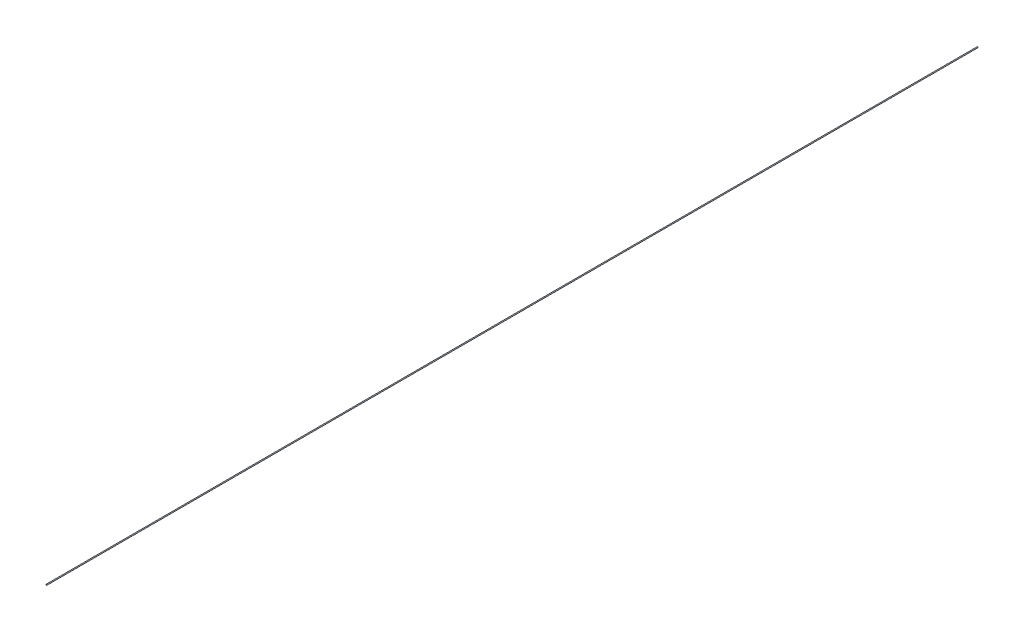
ISO-10303-21;
HEADER;
FILE_DESCRIPTION(('STEP AP214'),'2;1');
FILE_NAME('part.step','',(''),(''),'','','');
FILE_SCHEMA(('AUTOMOTIVE_DESIGN { 1 0 10303 214 1 1 1 1 }'));
ENDSEC;
DATA;
#1=APPLICATION_CONTEXT('core data for automotive mechanical design processes');
#2=APPLICATION_PROTOCOL_DEFINITION('international standard','automotive_design',2000,#1);
#3=PRODUCT_CONTEXT('',#1,'mechanical');
#4=PRODUCT('Part','Part','',(#3));
#5=PRODUCT_RELATED_PRODUCT_CATEGORY('part','',(#4));
#6=PRODUCT_DEFINITION_FORMATION('','',#4);
#7=PRODUCT_DEFINITION_CONTEXT('part definition',#1,'design');
#8=PRODUCT_DEFINITION('design','',#6,#7);
#9=PRODUCT_DEFINITION_SHAPE('','',#8);
#10=(LENGTH_UNIT() NAMED_UNIT(*) SI_UNIT(.MILLI.,.METRE.));
#11=(NAMED_UNIT(*) PLANE_ANGLE_UNIT() SI_UNIT($,.RADIAN.));
#12=(NAMED_UNIT(*) SI_UNIT($,.STERADIAN.) SOLID_ANGLE_UNIT());
#13=UNCERTAINTY_MEASURE_WITH_UNIT(LENGTH_MEASURE(1.E-05),#10,'distance_accuracy_value','');
#14=(GEOMETRIC_REPRESENTATION_CONTEXT(3) GLOBAL_UNCERTAINTY_ASSIGNED_CONTEXT((#13)) GLOBAL_UNIT_ASSIGNED_CONTEXT((#10,
#11,#12)) REPRESENTATION_CONTEXT('',''));
#15=CARTESIAN_POINT('',(0.,0.,0.));
#16=DIRECTION('',(0.,0.,1.));
#17=DIRECTION('',(1.,0.,0.));
#18=AXIS2_PLACEMENT_3D('',#15,#16,#17);
#19=CARTESIAN_POINT('',(0.,0.,508.));
#20=DIRECTION('',(0.,0.,-1.));
#21=DIRECTION('',(-1.,0.,0.));
#22=AXIS2_PLACEMENT_3D('',#19,#20,#21);
#23=CYLINDRICAL_SURFACE('',#22,0.5);
#24=CARTESIAN_POINT('',(0.,0.,507.6));
#25=DIRECTION('',(0.,0.,1.));
#26=DIRECTION('',(1.,0.,0.));
#27=AXIS2_PLACEMENT_3D('',#24,#25,#26);
#28=CIRCLE('',#27,0.5);
#29=CARTESIAN_POINT('',(0.5,0.,507.6));
#30=VERTEX_POINT('',#29);
#31=EDGE_CURVE('E45',#30,#30,#28,.F.);
#32=ORIENTED_EDGE('',*,*,#31,.T.);
#33=EDGE_LOOP('',(#32));
#34=FACE_BOUND('',#33,.T.);
#35=CARTESIAN_POINT('',(0.,0.,-507.6));
#36=DIRECTION('',(0.,0.,1.));
#37=DIRECTION('',(1.,0.,0.));
#38=AXIS2_PLACEMENT_3D('',#35,#36,#37);
#39=CIRCLE('',#38,0.5);
#40=CARTESIAN_POINT('',(0.5,0.,-507.6));
#41=VERTEX_POINT('',#40);
#42=EDGE_CURVE('E50',#41,#41,#39,.T.);
#43=ORIENTED_EDGE('',*,*,#42,.T.);
#44=EDGE_LOOP('',(#43));
#45=FACE_BOUND('',#44,.T.);
#46=ADVANCED_FACE('F37',(#34,#45),#23,.T.);
#47=CARTESIAN_POINT('',(0.,0.,508.));
#48=DIRECTION('',(0.,0.,1.));
#49=DIRECTION('',(1.,0.,0.));
#50=AXIS2_PLACEMENT_3D('',#47,#48,#49);
#51=PLANE('',#50);
#52=CARTESIAN_POINT('',(0.,0.,508.));
#53=DIRECTION('',(0.,0.,1.));
#54=DIRECTION('',(1.,0.,0.));
#55=AXIS2_PLACEMENT_3D('',#52,#53,#54);
#56=CIRCLE('',#55,0.1);
#57=CARTESIAN_POINT('',(0.1,0.,508.));
#58=VERTEX_POINT('',#57);
#59=EDGE_CURVE('E55',#58,#58,#56,.T.);
#60=ORIENTED_EDGE('',*,*,#59,.T.);
#61=EDGE_LOOP('',(#60));
#62=FACE_BOUND('',#61,.T.);
#63=ADVANCED_FACE('F62',(#62),#51,.T.);
#64=CARTESIAN_POINT('',(0.,0.,-508.));
#65=DIRECTION('',(0.,0.,1.));
#66=DIRECTION('',(1.,0.,0.));
#67=AXIS2_PLACEMENT_3D('',#64,#65,#66);
#68=PLANE('',#67);
#69=CARTESIAN_POINT('',(0.,0.,-508.));
#70=DIRECTION('',(0.,0.,1.));
#71=DIRECTION('',(1.,0.,0.));
#72=AXIS2_PLACEMENT_3D('',#69,#70,#71);
#73=CIRCLE('',#72,0.1);
#74=CARTESIAN_POINT('',(0.1,0.,-508.));
#75=VERTEX_POINT('',#74);
#76=EDGE_CURVE('E10',#75,#75,#73,.F.);
#77=ORIENTED_EDGE('',*,*,#76,.T.);
#78=EDGE_LOOP('',(#77));
#79=FACE_BOUND('',#78,.T.);
#80=ADVANCED_FACE('F66',(#79),#68,.F.);
#81=CARTESIAN_POINT('',(0.,0.,507.6));
#82=DIRECTION('',(0.,0.,1.));
#83=DIRECTION('',(1.,0.,0.));
#84=AXIS2_PLACEMENT_3D('',#81,#82,#83);
#85=DEGENERATE_TOROIDAL_SURFACE('',#84,0.1,0.4,.T.);
#86=ORIENTED_EDGE('',*,*,#31,.F.);
#87=EDGE_LOOP('',(#86));
#88=FACE_BOUND('',#87,.T.);
#89=ORIENTED_EDGE('',*,*,#59,.F.);
#90=EDGE_LOOP('',(#89));
#91=FACE_BOUND('',#90,.T.);
#92=ADVANCED_FACE('F64',(#88,#91),#85,.T.);
#93=CARTESIAN_POINT('',(0.,0.,-507.6));
#94=DIRECTION('',(0.,0.,1.));
#95=DIRECTION('',(1.,0.,0.));
#96=AXIS2_PLACEMENT_3D('',#93,#94,#95);
#97=DEGENERATE_TOROIDAL_SURFACE('',#96,0.1,0.4,.T.);
#98=ORIENTED_EDGE('',*,*,#76,.F.);
#99=EDGE_LOOP('',(#98));
#100=FACE_BOUND('',#99,.T.);
#101=ORIENTED_EDGE('',*,*,#42,.F.);
#102=EDGE_LOOP('',(#101));
#103=FACE_BOUND('',#102,.T.);
#104=ADVANCED_FACE('F39',(#100,#103),#97,.T.);
#105=CLOSED_SHELL('',(#46,#63,#80,#92,#104));
#106=MANIFOLD_SOLID_BREP('B2',#105);
#107=ADVANCED_BREP_SHAPE_REPRESENTATION('',(#18,#106),#14);
#108=SHAPE_DEFINITION_REPRESENTATION(#9,#107);
ENDSEC;
END-ISO-10303-21;
